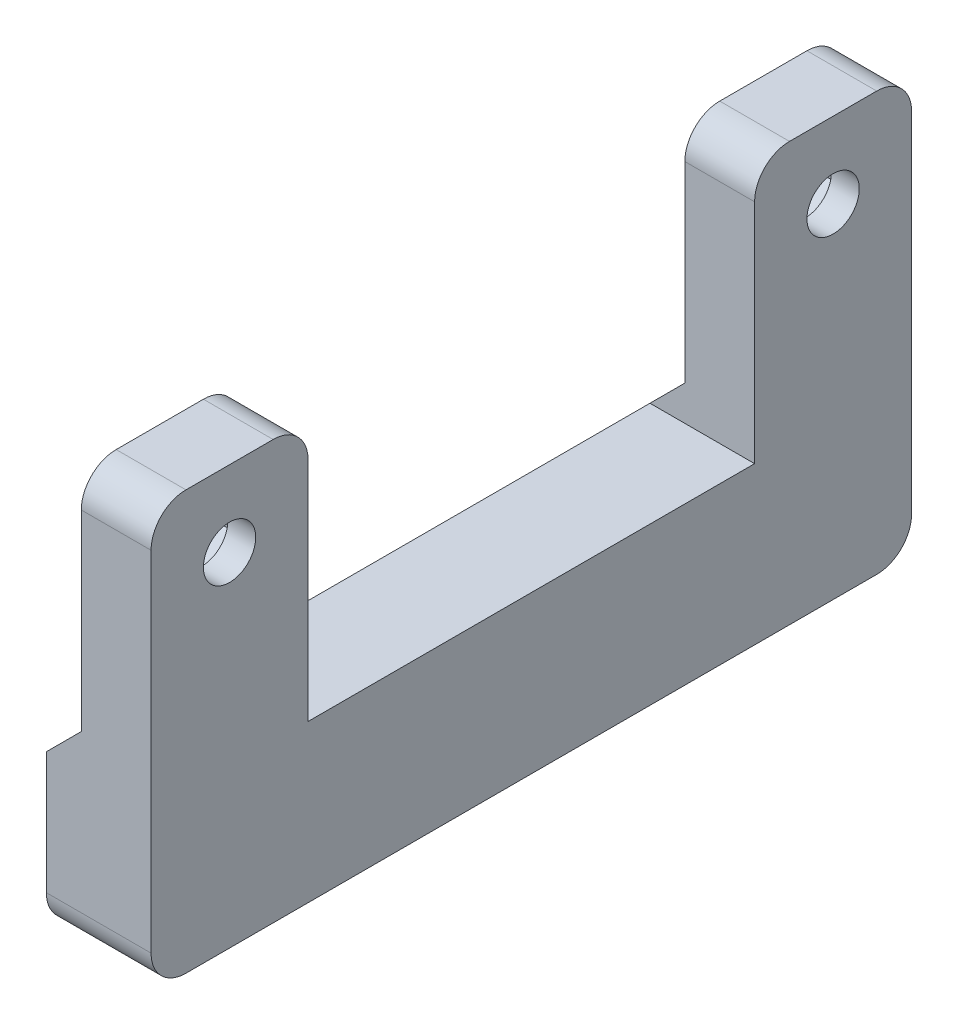
ISO-10303-21;
HEADER;
FILE_DESCRIPTION(('STEP AP214'),'2;1');
FILE_NAME('part.step','',(''),(''),'','','');
FILE_SCHEMA(('AUTOMOTIVE_DESIGN { 1 0 10303 214 1 1 1 1 }'));
ENDSEC;
DATA;
#1=APPLICATION_CONTEXT('core data for automotive mechanical design processes');
#2=APPLICATION_PROTOCOL_DEFINITION('international standard','automotive_design',2000,#1);
#3=PRODUCT_CONTEXT('',#1,'mechanical');
#4=PRODUCT('Part','Part','',(#3));
#5=PRODUCT_RELATED_PRODUCT_CATEGORY('part','',(#4));
#6=PRODUCT_DEFINITION_FORMATION('','',#4);
#7=PRODUCT_DEFINITION_CONTEXT('part definition',#1,'design');
#8=PRODUCT_DEFINITION('design','',#6,#7);
#9=PRODUCT_DEFINITION_SHAPE('','',#8);
#10=(LENGTH_UNIT() NAMED_UNIT(*) SI_UNIT(.MILLI.,.METRE.));
#11=(NAMED_UNIT(*) PLANE_ANGLE_UNIT() SI_UNIT($,.RADIAN.));
#12=(NAMED_UNIT(*) SI_UNIT($,.STERADIAN.) SOLID_ANGLE_UNIT());
#13=UNCERTAINTY_MEASURE_WITH_UNIT(LENGTH_MEASURE(1.E-05),#10,'distance_accuracy_value','');
#14=(GEOMETRIC_REPRESENTATION_CONTEXT(3) GLOBAL_UNCERTAINTY_ASSIGNED_CONTEXT((#13)) GLOBAL_UNIT_ASSIGNED_CONTEXT((#10,
#11,#12)) REPRESENTATION_CONTEXT('',''));
#15=CARTESIAN_POINT('',(0.,0.,0.));
#16=DIRECTION('',(0.,0.,1.));
#17=DIRECTION('',(1.,0.,0.));
#18=AXIS2_PLACEMENT_3D('',#15,#16,#17);
#19=CARTESIAN_POINT('',(0.,0.,0.));
#20=DIRECTION('',(1.,0.,0.));
#21=DIRECTION('',(0.,0.,-1.));
#22=AXIS2_PLACEMENT_3D('',#19,#20,#21);
#23=PLANE('',#22);
#24=DIRECTION('',(0.,-0.5,-0.866025403784439));
#25=VECTOR('',#24,1.);
#26=CARTESIAN_POINT('',(0.,5.33752026248425,10.4833333333333));
#27=LINE('',#26,#25);
#28=CARTESIAN_POINT('',(0.,5.33752026248425,10.4833333333333));
#29=VERTEX_POINT('',#28);
#30=CARTESIAN_POINT('',(0.,3.76424077894252,7.75833333333333));
#31=VERTEX_POINT('',#30);
#32=EDGE_CURVE('E294',#29,#31,#27,.T.);
#33=ORIENTED_EDGE('',*,*,#32,.F.);
#34=DIRECTION('',(0.,0.5,-0.866025403784439));
#35=VECTOR('',#34,1.);
#36=CARTESIAN_POINT('',(0.,3.76424077894252,13.2083333333333));
#37=LINE('',#36,#35);
#38=CARTESIAN_POINT('',(0.,3.76424077894252,13.2083333333333));
#39=VERTEX_POINT('',#38);
#40=EDGE_CURVE('E292',#39,#29,#37,.T.);
#41=ORIENTED_EDGE('',*,*,#40,.F.);
#42=DIRECTION('',(0.,1.,0.));
#43=VECTOR('',#42,1.);
#44=CARTESIAN_POINT('',(0.,0.617681811859059,13.2083333333333));
#45=LINE('',#44,#43);
#46=CARTESIAN_POINT('',(0.,0.617681811859059,13.2083333333333));
#47=VERTEX_POINT('',#46);
#48=EDGE_CURVE('E276',#47,#39,#45,.T.);
#49=ORIENTED_EDGE('',*,*,#48,.F.);
#50=DIRECTION('',(0.,0.5,0.866025403784439));
#51=VECTOR('',#50,1.);
#52=CARTESIAN_POINT('',(0.,-0.955597671682672,10.4833333333333));
#53=LINE('',#52,#51);
#54=CARTESIAN_POINT('',(0.,-0.955597671682672,10.4833333333333));
#55=VERTEX_POINT('',#54);
#56=EDGE_CURVE('E304',#55,#47,#53,.T.);
#57=ORIENTED_EDGE('',*,*,#56,.F.);
#58=DIRECTION('',(0.,-0.5,0.866025403784438));
#59=VECTOR('',#58,1.);
#60=CARTESIAN_POINT('',(0.,0.617681811859061,7.75833333333333));
#61=LINE('',#60,#59);
#62=CARTESIAN_POINT('',(0.,0.617681811859061,7.75833333333333));
#63=VERTEX_POINT('',#62);
#64=EDGE_CURVE('E301',#63,#55,#61,.T.);
#65=ORIENTED_EDGE('',*,*,#64,.F.);
#66=DIRECTION('',(0.,-1.,0.));
#67=VECTOR('',#66,1.);
#68=CARTESIAN_POINT('',(0.,3.76424077894252,7.75833333333333));
#69=LINE('',#68,#67);
#70=EDGE_CURVE('E298',#31,#63,#69,.T.);
#71=ORIENTED_EDGE('',*,*,#70,.F.);
#72=EDGE_LOOP('',(#33,#41,#49,#57,#65,#71));
#73=FACE_BOUND('',#72,.T.);
#74=DIRECTION('',(0.,-1.,0.));
#75=VECTOR('',#74,1.);
#76=CARTESIAN_POINT('',(0.,6.54166666666667,14.9833333333333));
#77=LINE('',#76,#75);
#78=CARTESIAN_POINT('',(0.,4.54166666666667,14.9833333333333));
#79=VERTEX_POINT('',#78);
#80=CARTESIAN_POINT('',(0.,-6.45833333333333,14.9833333333333));
#81=VERTEX_POINT('',#80);
#82=EDGE_CURVE('E405',#79,#81,#77,.T.);
#83=ORIENTED_EDGE('',*,*,#82,.F.);
#84=CARTESIAN_POINT('',(0.,4.54166666666667,12.9833333333333));
#85=DIRECTION('',(1.,0.,0.));
#86=DIRECTION('',(0.,0.,-1.));
#87=AXIS2_PLACEMENT_3D('',#84,#85,#86);
#88=CIRCLE('',#87,2.);
#89=CARTESIAN_POINT('',(0.,6.54166666666667,12.9833333333333));
#90=VERTEX_POINT('',#89);
#91=EDGE_CURVE('E455',#79,#90,#88,.F.);
#92=ORIENTED_EDGE('',*,*,#91,.T.);
#93=DIRECTION('',(0.,0.,1.));
#94=VECTOR('',#93,1.);
#95=CARTESIAN_POINT('',(0.,6.54166666666667,5.98333333333334));
#96=LINE('',#95,#94);
#97=CARTESIAN_POINT('',(0.,6.54166666666667,7.98333333333334));
#98=VERTEX_POINT('',#97);
#99=EDGE_CURVE('E402',#98,#90,#96,.T.);
#100=ORIENTED_EDGE('',*,*,#99,.F.);
#101=CARTESIAN_POINT('',(0.,4.54166666666667,7.98333333333334));
#102=DIRECTION('',(1.,0.,0.));
#103=DIRECTION('',(0.,0.,-1.));
#104=AXIS2_PLACEMENT_3D('',#101,#102,#103);
#105=CIRCLE('',#104,2.);
#106=CARTESIAN_POINT('',(0.,4.54166666666667,5.98333333333334));
#107=VERTEX_POINT('',#106);
#108=EDGE_CURVE('E453',#98,#107,#105,.F.);
#109=ORIENTED_EDGE('',*,*,#108,.T.);
#110=DIRECTION('',(0.,1.,0.));
#111=VECTOR('',#110,1.);
#112=CARTESIAN_POINT('',(0.,-17.4583333333333,5.98333333333334));
#113=LINE('',#112,#111);
#114=CARTESIAN_POINT('',(0.,-6.45833333333333,5.98333333333334));
#115=VERTEX_POINT('',#114);
#116=EDGE_CURVE('E399',#115,#107,#113,.T.);
#117=ORIENTED_EDGE('',*,*,#116,.F.);
#118=DIRECTION('',(0.,0.,-1.));
#119=VECTOR('',#118,1.);
#120=CARTESIAN_POINT('',(0.,-6.45833333333333,5.98333333333334));
#121=LINE('',#120,#119);
#122=EDGE_CURVE('E269',#81,#115,#121,.T.);
#123=ORIENTED_EDGE('',*,*,#122,.F.);
#124=EDGE_LOOP('',(#83,#92,#100,#109,#117,#123));
#125=FACE_BOUND('',#124,.T.);
#126=ADVANCED_FACE('F37',(#73,#125),#23,.F.);
#127=DIRECTION('',(0.,-0.5,-0.866025403784439));
#128=VECTOR('',#127,1.);
#129=CARTESIAN_POINT('',(0.,5.33752026248426,45.0833333333333));
#130=LINE('',#129,#128);
#131=CARTESIAN_POINT('',(0.,5.33752026248425,45.0833333333333));
#132=VERTEX_POINT('',#131);
#133=CARTESIAN_POINT('',(0.,3.76424077894252,42.3583333333333));
#134=VERTEX_POINT('',#133);
#135=EDGE_CURVE('E262',#132,#134,#130,.T.);
#136=ORIENTED_EDGE('',*,*,#135,.F.);
#137=DIRECTION('',(0.,0.5,-0.866025403784438));
#138=VECTOR('',#137,1.);
#139=CARTESIAN_POINT('',(0.,3.76424077894252,47.8083333333333));
#140=LINE('',#139,#138);
#141=CARTESIAN_POINT('',(0.,3.76424077894252,47.8083333333333));
#142=VERTEX_POINT('',#141);
#143=EDGE_CURVE('E260',#142,#132,#140,.T.);
#144=ORIENTED_EDGE('',*,*,#143,.F.);
#145=DIRECTION('',(0.,1.,0.));
#146=VECTOR('',#145,1.);
#147=CARTESIAN_POINT('',(0.,0.617681811859057,47.8083333333333));
#148=LINE('',#147,#146);
#149=CARTESIAN_POINT('',(0.,0.617681811859057,47.8083333333333));
#150=VERTEX_POINT('',#149);
#151=EDGE_CURVE('E326',#150,#142,#148,.T.);
#152=ORIENTED_EDGE('',*,*,#151,.F.);
#153=DIRECTION('',(0.,0.5,0.866025403784439));
#154=VECTOR('',#153,1.);
#155=CARTESIAN_POINT('',(0.,-0.955597671682677,45.0833333333333));
#156=LINE('',#155,#154);
#157=CARTESIAN_POINT('',(0.,-0.955597671682677,45.0833333333333));
#158=VERTEX_POINT('',#157);
#159=EDGE_CURVE('E350',#158,#150,#156,.T.);
#160=ORIENTED_EDGE('',*,*,#159,.F.);
#161=DIRECTION('',(0.,-0.5,0.866025403784438));
#162=VECTOR('',#161,1.);
#163=CARTESIAN_POINT('',(0.,0.617681811859057,42.3583333333333));
#164=LINE('',#163,#162);
#165=CARTESIAN_POINT('',(0.,0.617681811859057,42.3583333333333));
#166=VERTEX_POINT('',#165);
#167=EDGE_CURVE('E347',#166,#158,#164,.T.);
#168=ORIENTED_EDGE('',*,*,#167,.F.);
#169=DIRECTION('',(0.,-1.,0.));
#170=VECTOR('',#169,1.);
#171=CARTESIAN_POINT('',(0.,3.76424077894252,42.3583333333333));
#172=LINE('',#171,#170);
#173=EDGE_CURVE('E344',#134,#166,#172,.T.);
#174=ORIENTED_EDGE('',*,*,#173,.F.);
#175=EDGE_LOOP('',(#136,#144,#152,#160,#168,#174));
#176=FACE_BOUND('',#175,.T.);
#177=DIRECTION('',(0.,0.,1.));
#178=VECTOR('',#177,1.);
#179=CARTESIAN_POINT('',(0.,6.54166666666667,40.5833333333333));
#180=LINE('',#179,#178);
#181=CARTESIAN_POINT('',(0.,6.54166666666667,42.5833333333333));
#182=VERTEX_POINT('',#181);
#183=CARTESIAN_POINT('',(0.,6.54166666666667,47.5833333333333));
#184=VERTEX_POINT('',#183);
#185=EDGE_CURVE('E369',#182,#184,#180,.T.);
#186=ORIENTED_EDGE('',*,*,#185,.F.);
#187=CARTESIAN_POINT('',(0.,4.54166666666667,42.5833333333333));
#188=DIRECTION('',(1.,0.,0.));
#189=DIRECTION('',(0.,0.,-1.));
#190=AXIS2_PLACEMENT_3D('',#187,#188,#189);
#191=CIRCLE('',#190,2.);
#192=CARTESIAN_POINT('',(0.,4.54166666666667,40.5833333333333));
#193=VERTEX_POINT('',#192);
#194=EDGE_CURVE('E446',#182,#193,#191,.F.);
#195=ORIENTED_EDGE('',*,*,#194,.T.);
#196=DIRECTION('',(0.,1.,0.));
#197=VECTOR('',#196,1.);
#198=CARTESIAN_POINT('',(0.,-8.45833333333334,40.5833333333333));
#199=LINE('',#198,#197);
#200=CARTESIAN_POINT('',(0.,-6.45833333333333,40.5833333333333));
#201=VERTEX_POINT('',#200);
#202=EDGE_CURVE('E378',#201,#193,#199,.T.);
#203=ORIENTED_EDGE('',*,*,#202,.F.);
#204=DIRECTION('',(0.,0.,-1.));
#205=VECTOR('',#204,1.);
#206=CARTESIAN_POINT('',(0.,-6.45833333333333,40.5833333333333));
#207=LINE('',#206,#205);
#208=CARTESIAN_POINT('',(0.,-6.45833333333333,49.5833333333333));
#209=VERTEX_POINT('',#208);
#210=EDGE_CURVE('E232',#209,#201,#207,.T.);
#211=ORIENTED_EDGE('',*,*,#210,.F.);
#212=DIRECTION('',(0.,-1.,0.));
#213=VECTOR('',#212,1.);
#214=CARTESIAN_POINT('',(0.,6.54166666666667,49.5833333333333));
#215=LINE('',#214,#213);
#216=CARTESIAN_POINT('',(0.,4.54166666666667,49.5833333333333));
#217=VERTEX_POINT('',#216);
#218=EDGE_CURVE('E397',#217,#209,#215,.T.);
#219=ORIENTED_EDGE('',*,*,#218,.F.);
#220=CARTESIAN_POINT('',(0.,4.54166666666667,47.5833333333333));
#221=DIRECTION('',(1.,0.,0.));
#222=DIRECTION('',(0.,0.,-1.));
#223=AXIS2_PLACEMENT_3D('',#220,#221,#222);
#224=CIRCLE('',#223,2.);
#225=EDGE_CURVE('E444',#217,#184,#224,.F.);
#226=ORIENTED_EDGE('',*,*,#225,.T.);
#227=EDGE_LOOP('',(#186,#195,#203,#211,#219,#226));
#228=FACE_BOUND('',#227,.T.);
#229=ADVANCED_FACE('F511',(#176,#228),#23,.F.);
#230=CARTESIAN_POINT('',(4.,2.19096129540079,45.0833333333333));
#231=DIRECTION('',(-1.,0.,0.));
#232=DIRECTION('',(0.,0.,1.));
#233=AXIS2_PLACEMENT_3D('',#230,#231,#232);
#234=CYLINDRICAL_SURFACE('',#233,1.5);
#235=CARTESIAN_POINT('',(4.,2.19096129540079,45.0833333333333));
#236=DIRECTION('',(-1.,0.,0.));
#237=DIRECTION('',(0.,0.,1.));
#238=AXIS2_PLACEMENT_3D('',#235,#236,#237);
#239=CIRCLE('',#238,1.5);
#240=CARTESIAN_POINT('',(4.,2.19096129540079,46.5833333333333));
#241=VERTEX_POINT('',#240);
#242=EDGE_CURVE('E370',#241,#241,#239,.T.);
#243=ORIENTED_EDGE('',*,*,#242,.F.);
#244=EDGE_LOOP('',(#243));
#245=FACE_BOUND('',#244,.T.);
#246=CARTESIAN_POINT('',(2.4,2.19096129540079,45.0833333333333));
#247=DIRECTION('',(-1.,0.,0.));
#248=DIRECTION('',(0.,0.,1.));
#249=AXIS2_PLACEMENT_3D('',#246,#247,#248);
#250=CIRCLE('',#249,1.5);
#251=CARTESIAN_POINT('',(2.4,2.19096129540079,46.5833333333333));
#252=VERTEX_POINT('',#251);
#253=EDGE_CURVE('E373',#252,#252,#250,.F.);
#254=ORIENTED_EDGE('',*,*,#253,.F.);
#255=EDGE_LOOP('',(#254));
#256=FACE_BOUND('',#255,.T.);
#257=ADVANCED_FACE('F517',(#245,#256),#234,.F.);
#258=CARTESIAN_POINT('',(4.,2.19096129540079,10.4833333333333));
#259=DIRECTION('',(-1.,0.,0.));
#260=DIRECTION('',(0.,0.,1.));
#261=AXIS2_PLACEMENT_3D('',#258,#259,#260);
#262=CYLINDRICAL_SURFACE('',#261,1.5);
#263=CARTESIAN_POINT('',(4.,2.19096129540079,10.4833333333333));
#264=DIRECTION('',(-1.,0.,0.));
#265=DIRECTION('',(0.,0.,1.));
#266=AXIS2_PLACEMENT_3D('',#263,#264,#265);
#267=CIRCLE('',#266,1.5);
#268=CARTESIAN_POINT('',(4.,2.19096129540079,11.9833333333333));
#269=VERTEX_POINT('',#268);
#270=EDGE_CURVE('E366',#269,#269,#267,.T.);
#271=ORIENTED_EDGE('',*,*,#270,.F.);
#272=EDGE_LOOP('',(#271));
#273=FACE_BOUND('',#272,.T.);
#274=CARTESIAN_POINT('',(2.4,2.19096129540079,10.4833333333333));
#275=DIRECTION('',(-1.,0.,0.));
#276=DIRECTION('',(0.,0.,1.));
#277=AXIS2_PLACEMENT_3D('',#274,#275,#276);
#278=CIRCLE('',#277,1.5);
#279=CARTESIAN_POINT('',(2.4,2.19096129540079,11.9833333333333));
#280=VERTEX_POINT('',#279);
#281=EDGE_CURVE('E311',#280,#280,#278,.F.);
#282=ORIENTED_EDGE('',*,*,#281,.F.);
#283=EDGE_LOOP('',(#282));
#284=FACE_BOUND('',#283,.T.);
#285=ADVANCED_FACE('F541',(#273,#284),#262,.F.);
#286=CARTESIAN_POINT('',(4.,6.54166666666667,40.5833333333333));
#287=DIRECTION('',(0.,-1.,0.));
#288=DIRECTION('',(0.,0.,-1.));
#289=AXIS2_PLACEMENT_3D('',#286,#287,#288);
#290=PLANE('',#289);
#291=DIRECTION('',(0.,0.,1.));
#292=VECTOR('',#291,1.);
#293=CARTESIAN_POINT('',(4.,6.54166666666667,40.5833333333333));
#294=LINE('',#293,#292);
#295=CARTESIAN_POINT('',(4.,6.54166666666667,42.5833333333333));
#296=VERTEX_POINT('',#295);
#297=CARTESIAN_POINT('',(4.,6.54166666666667,47.5833333333333));
#298=VERTEX_POINT('',#297);
#299=EDGE_CURVE('E374',#296,#298,#294,.T.);
#300=ORIENTED_EDGE('',*,*,#299,.F.);
#301=DIRECTION('',(-1.,0.,0.));
#302=VECTOR('',#301,1.);
#303=CARTESIAN_POINT('',(4.,6.54166666666667,42.5833333333333));
#304=LINE('',#303,#302);
#305=EDGE_CURVE('E441',#296,#182,#304,.T.);
#306=ORIENTED_EDGE('',*,*,#305,.T.);
#307=ORIENTED_EDGE('',*,*,#185,.T.);
#308=DIRECTION('',(-1.,0.,0.));
#309=VECTOR('',#308,1.);
#310=CARTESIAN_POINT('',(4.,6.54166666666667,47.5833333333333));
#311=LINE('',#310,#309);
#312=EDGE_CURVE('E439',#184,#298,#311,.F.);
#313=ORIENTED_EDGE('',*,*,#312,.T.);
#314=EDGE_LOOP('',(#300,#306,#307,#313));
#315=FACE_BOUND('',#314,.T.);
#316=ADVANCED_FACE('F538',(#315),#290,.F.);
#317=CARTESIAN_POINT('',(4.,6.54166666666667,49.5833333333333));
#318=DIRECTION('',(0.,0.,-1.));
#319=DIRECTION('',(-1.,0.,0.));
#320=AXIS2_PLACEMENT_3D('',#317,#318,#319);
#321=PLANE('',#320);
#322=ORIENTED_EDGE('',*,*,#218,.T.);
#323=DIRECTION('',(0.707106781186549,0.707106781186546,0.));
#324=VECTOR('',#323,1.);
#325=CARTESIAN_POINT('',(-2.,-8.45833333333333,49.5833333333333));
#326=LINE('',#325,#324);
#327=CARTESIAN_POINT('',(-2.,-8.45833333333333,49.5833333333333));
#328=VERTEX_POINT('',#327);
#329=EDGE_CURVE('E11',#209,#328,#326,.F.);
#330=ORIENTED_EDGE('',*,*,#329,.T.);
#331=DIRECTION('',(0.,1.,0.));
#332=VECTOR('',#331,1.);
#333=CARTESIAN_POINT('',(-2.,-6.45833333333333,49.5833333333333));
#334=LINE('',#333,#332);
#335=CARTESIAN_POINT('',(-2.,-15.4583333333333,49.5833333333333));
#336=VERTEX_POINT('',#335);
#337=EDGE_CURVE('E243',#336,#328,#334,.T.);
#338=ORIENTED_EDGE('',*,*,#337,.F.);
#339=DIRECTION('',(-1.,0.,0.));
#340=VECTOR('',#339,1.);
#341=CARTESIAN_POINT('',(4.,-15.4583333333333,49.5833333333333));
#342=LINE('',#341,#340);
#343=CARTESIAN_POINT('',(4.,-15.4583333333333,49.5833333333333));
#344=VERTEX_POINT('',#343);
#345=EDGE_CURVE('E425',#336,#344,#342,.F.);
#346=ORIENTED_EDGE('',*,*,#345,.T.);
#347=DIRECTION('',(0.,-1.,0.));
#348=VECTOR('',#347,1.);
#349=CARTESIAN_POINT('',(4.,6.54166666666667,49.5833333333333));
#350=LINE('',#349,#348);
#351=CARTESIAN_POINT('',(4.,4.54166666666667,49.5833333333333));
#352=VERTEX_POINT('',#351);
#353=EDGE_CURVE('E377',#352,#344,#350,.T.);
#354=ORIENTED_EDGE('',*,*,#353,.F.);
#355=DIRECTION('',(-1.,0.,0.));
#356=VECTOR('',#355,1.);
#357=CARTESIAN_POINT('',(4.,4.54166666666667,49.5833333333333));
#358=LINE('',#357,#356);
#359=EDGE_CURVE('E422',#352,#217,#358,.T.);
#360=ORIENTED_EDGE('',*,*,#359,.T.);
#361=EDGE_LOOP('',(#322,#330,#338,#346,#354,#360));
#362=FACE_BOUND('',#361,.T.);
#363=ADVANCED_FACE('F535',(#362),#321,.F.);
#364=CARTESIAN_POINT('',(4.,-17.4583333333333,49.5833333333333));
#365=DIRECTION('',(0.,1.,0.));
#366=DIRECTION('',(0.,0.,1.));
#367=AXIS2_PLACEMENT_3D('',#364,#365,#366);
#368=PLANE('',#367);
#369=DIRECTION('',(0.,0.,-1.));
#370=VECTOR('',#369,1.);
#371=CARTESIAN_POINT('',(4.,-17.4583333333333,49.5833333333333));
#372=LINE('',#371,#370);
#373=CARTESIAN_POINT('',(4.,-17.4583333333333,47.5833333333333));
#374=VERTEX_POINT('',#373);
#375=CARTESIAN_POINT('',(4.,-17.4583333333333,7.98333333333334));
#376=VERTEX_POINT('',#375);
#377=EDGE_CURVE('E381',#374,#376,#372,.T.);
#378=ORIENTED_EDGE('',*,*,#377,.F.);
#379=DIRECTION('',(-1.,0.,0.));
#380=VECTOR('',#379,1.);
#381=CARTESIAN_POINT('',(4.,-17.4583333333333,47.5833333333333));
#382=LINE('',#381,#380);
#383=CARTESIAN_POINT('',(-2.,-17.4583333333333,47.5833333333333));
#384=VERTEX_POINT('',#383);
#385=EDGE_CURVE('E415',#374,#384,#382,.T.);
#386=ORIENTED_EDGE('',*,*,#385,.T.);
#387=DIRECTION('',(0.,0.,1.));
#388=VECTOR('',#387,1.);
#389=CARTESIAN_POINT('',(-2.,-17.4583333333333,49.5833333333333));
#390=LINE('',#389,#388);
#391=CARTESIAN_POINT('',(-2.,-17.4583333333333,7.98333333333334));
#392=VERTEX_POINT('',#391);
#393=EDGE_CURVE('E264',#392,#384,#390,.T.);
#394=ORIENTED_EDGE('',*,*,#393,.F.);
#395=DIRECTION('',(-1.,0.,0.));
#396=VECTOR('',#395,1.);
#397=CARTESIAN_POINT('',(4.,-17.4583333333333,7.98333333333334));
#398=LINE('',#397,#396);
#399=EDGE_CURVE('E409',#392,#376,#398,.F.);
#400=ORIENTED_EDGE('',*,*,#399,.T.);
#401=EDGE_LOOP('',(#378,#386,#394,#400));
#402=FACE_BOUND('',#401,.T.);
#403=ADVANCED_FACE('F488',(#402),#368,.F.);
#404=CARTESIAN_POINT('',(4.,-17.4583333333333,5.98333333333334));
#405=DIRECTION('',(0.,0.,1.));
#406=DIRECTION('',(0.,-1.,0.));
#407=AXIS2_PLACEMENT_3D('',#404,#405,#406);
#408=PLANE('',#407);
#409=DIRECTION('',(0.,-1.,0.));
#410=VECTOR('',#409,1.);
#411=CARTESIAN_POINT('',(-2.,-17.4583333333333,5.98333333333334));
#412=LINE('',#411,#410);
#413=CARTESIAN_POINT('',(-2.,-8.45833333333333,5.98333333333334));
#414=VERTEX_POINT('',#413);
#415=CARTESIAN_POINT('',(-2.,-15.4583333333333,5.98333333333334));
#416=VERTEX_POINT('',#415);
#417=EDGE_CURVE('E271',#414,#416,#412,.T.);
#418=ORIENTED_EDGE('',*,*,#417,.F.);
#419=DIRECTION('',(-0.707106781186549,-0.707106781186546,0.));
#420=VECTOR('',#419,1.);
#421=CARTESIAN_POINT('',(-2.,-8.45833333333333,5.98333333333334));
#422=LINE('',#421,#420);
#423=EDGE_CURVE('E53',#414,#115,#422,.F.);
#424=ORIENTED_EDGE('',*,*,#423,.T.);
#425=ORIENTED_EDGE('',*,*,#116,.T.);
#426=DIRECTION('',(-1.,0.,0.));
#427=VECTOR('',#426,1.);
#428=CARTESIAN_POINT('',(4.,4.54166666666667,5.98333333333334));
#429=LINE('',#428,#427);
#430=CARTESIAN_POINT('',(4.,4.54166666666667,5.98333333333334));
#431=VERTEX_POINT('',#430);
#432=EDGE_CURVE('E245',#107,#431,#429,.F.);
#433=ORIENTED_EDGE('',*,*,#432,.T.);
#434=DIRECTION('',(0.,1.,0.));
#435=VECTOR('',#434,1.);
#436=CARTESIAN_POINT('',(4.,-17.4583333333333,5.98333333333334));
#437=LINE('',#436,#435);
#438=CARTESIAN_POINT('',(4.,-15.4583333333333,5.98333333333334));
#439=VERTEX_POINT('',#438);
#440=EDGE_CURVE('E384',#439,#431,#437,.T.);
#441=ORIENTED_EDGE('',*,*,#440,.F.);
#442=DIRECTION('',(-1.,0.,0.));
#443=VECTOR('',#442,1.);
#444=CARTESIAN_POINT('',(4.,-15.4583333333333,5.98333333333334));
#445=LINE('',#444,#443);
#446=EDGE_CURVE('E462',#439,#416,#445,.T.);
#447=ORIENTED_EDGE('',*,*,#446,.T.);
#448=EDGE_LOOP('',(#418,#424,#425,#433,#441,#447));
#449=FACE_BOUND('',#448,.T.);
#450=ADVANCED_FACE('F478',(#449),#408,.F.);
#451=CARTESIAN_POINT('',(4.,6.54166666666667,5.98333333333334));
#452=DIRECTION('',(0.,-1.,0.));
#453=DIRECTION('',(0.,0.,-1.));
#454=AXIS2_PLACEMENT_3D('',#451,#452,#453);
#455=PLANE('',#454);
#456=ORIENTED_EDGE('',*,*,#99,.T.);
#457=DIRECTION('',(-1.,0.,0.));
#458=VECTOR('',#457,1.);
#459=CARTESIAN_POINT('',(4.,6.54166666666667,12.9833333333333));
#460=LINE('',#459,#458);
#461=CARTESIAN_POINT('',(4.,6.54166666666667,12.9833333333333));
#462=VERTEX_POINT('',#461);
#463=EDGE_CURVE('E460',#90,#462,#460,.F.);
#464=ORIENTED_EDGE('',*,*,#463,.T.);
#465=DIRECTION('',(0.,0.,1.));
#466=VECTOR('',#465,1.);
#467=CARTESIAN_POINT('',(4.,6.54166666666667,5.98333333333334));
#468=LINE('',#467,#466);
#469=CARTESIAN_POINT('',(4.,6.54166666666667,7.98333333333334));
#470=VERTEX_POINT('',#469);
#471=EDGE_CURVE('E387',#470,#462,#468,.T.);
#472=ORIENTED_EDGE('',*,*,#471,.F.);
#473=DIRECTION('',(-1.,0.,0.));
#474=VECTOR('',#473,1.);
#475=CARTESIAN_POINT('',(4.,6.54166666666667,7.98333333333334));
#476=LINE('',#475,#474);
#477=EDGE_CURVE('E457',#470,#98,#476,.T.);
#478=ORIENTED_EDGE('',*,*,#477,.T.);
#479=EDGE_LOOP('',(#456,#464,#472,#478));
#480=FACE_BOUND('',#479,.T.);
#481=ADVANCED_FACE('F503',(#480),#455,.F.);
#482=CARTESIAN_POINT('',(4.,6.54166666666667,14.9833333333333));
#483=DIRECTION('',(0.,0.,-1.));
#484=DIRECTION('',(0.,1.,0.));
#485=AXIS2_PLACEMENT_3D('',#482,#483,#484);
#486=PLANE('',#485);
#487=ORIENTED_EDGE('',*,*,#82,.T.);
#488=DIRECTION('',(0.707106781186549,0.707106781186546,0.));
#489=VECTOR('',#488,1.);
#490=CARTESIAN_POINT('',(-2.,-8.45833333333333,14.9833333333333));
#491=LINE('',#490,#489);
#492=CARTESIAN_POINT('',(-2.,-8.45833333333334,14.9833333333333));
#493=VERTEX_POINT('',#492);
#494=EDGE_CURVE('E237',#81,#493,#491,.F.);
#495=ORIENTED_EDGE('',*,*,#494,.T.);
#496=DIRECTION('',(-1.,0.,0.));
#497=VECTOR('',#496,1.);
#498=CARTESIAN_POINT('',(4.,-8.45833333333333,14.9833333333333));
#499=LINE('',#498,#497);
#500=CARTESIAN_POINT('',(4.,-8.45833333333333,14.9833333333333));
#501=VERTEX_POINT('',#500);
#502=EDGE_CURVE('E255',#501,#493,#499,.T.);
#503=ORIENTED_EDGE('',*,*,#502,.F.);
#504=DIRECTION('',(0.,-1.,0.));
#505=VECTOR('',#504,1.);
#506=CARTESIAN_POINT('',(4.,6.54166666666667,14.9833333333333));
#507=LINE('',#506,#505);
#508=CARTESIAN_POINT('',(4.,4.54166666666667,14.9833333333333));
#509=VERTEX_POINT('',#508);
#510=EDGE_CURVE('E390',#509,#501,#507,.T.);
#511=ORIENTED_EDGE('',*,*,#510,.F.);
#512=DIRECTION('',(-1.,0.,0.));
#513=VECTOR('',#512,1.);
#514=CARTESIAN_POINT('',(4.,4.54166666666667,14.9833333333333));
#515=LINE('',#514,#513);
#516=EDGE_CURVE('E450',#509,#79,#515,.T.);
#517=ORIENTED_EDGE('',*,*,#516,.T.);
#518=EDGE_LOOP('',(#487,#495,#503,#511,#517));
#519=FACE_BOUND('',#518,.T.);
#520=ADVANCED_FACE('F470',(#519),#486,.F.);
#521=CARTESIAN_POINT('',(4.,-8.45833333333333,14.9833333333333));
#522=DIRECTION('',(0.,-1.,0.));
#523=DIRECTION('',(0.,0.,-1.));
#524=AXIS2_PLACEMENT_3D('',#521,#522,#523);
#525=PLANE('',#524);
#526=ORIENTED_EDGE('',*,*,#502,.T.);
#527=DIRECTION('',(0.,0.,-1.));
#528=VECTOR('',#527,1.);
#529=CARTESIAN_POINT('',(-2.,-8.45833333333334,14.9833333333333));
#530=LINE('',#529,#528);
#531=CARTESIAN_POINT('',(-2.,-8.45833333333334,40.5833333333333));
#532=VERTEX_POINT('',#531);
#533=EDGE_CURVE('E242',#532,#493,#530,.T.);
#534=ORIENTED_EDGE('',*,*,#533,.F.);
#535=DIRECTION('',(-1.,0.,0.));
#536=VECTOR('',#535,1.);
#537=CARTESIAN_POINT('',(4.,-8.45833333333334,40.5833333333333));
#538=LINE('',#537,#536);
#539=CARTESIAN_POINT('',(4.,-8.45833333333334,40.5833333333333));
#540=VERTEX_POINT('',#539);
#541=EDGE_CURVE('E249',#540,#532,#538,.T.);
#542=ORIENTED_EDGE('',*,*,#541,.F.);
#543=DIRECTION('',(0.,0.,1.));
#544=VECTOR('',#543,1.);
#545=CARTESIAN_POINT('',(4.,-8.45833333333333,14.9833333333333));
#546=LINE('',#545,#544);
#547=EDGE_CURVE('E392',#501,#540,#546,.T.);
#548=ORIENTED_EDGE('',*,*,#547,.F.);
#549=EDGE_LOOP('',(#526,#534,#542,#548));
#550=FACE_BOUND('',#549,.T.);
#551=ADVANCED_FACE('F258',(#550),#525,.F.);
#552=CARTESIAN_POINT('',(4.,-8.45833333333334,40.5833333333333));
#553=DIRECTION('',(0.,0.,1.));
#554=DIRECTION('',(0.,-1.,0.));
#555=AXIS2_PLACEMENT_3D('',#552,#553,#554);
#556=PLANE('',#555);
#557=ORIENTED_EDGE('',*,*,#541,.T.);
#558=DIRECTION('',(-0.707106781186549,-0.707106781186546,0.));
#559=VECTOR('',#558,1.);
#560=CARTESIAN_POINT('',(-1.99999999999999,-8.45833333333332,40.5833333333333));
#561=LINE('',#560,#559);
#562=EDGE_CURVE('E46',#532,#201,#561,.F.);
#563=ORIENTED_EDGE('',*,*,#562,.T.);
#564=ORIENTED_EDGE('',*,*,#202,.T.);
#565=DIRECTION('',(-1.,0.,0.));
#566=VECTOR('',#565,1.);
#567=CARTESIAN_POINT('',(4.,4.54166666666667,40.5833333333333));
#568=LINE('',#567,#566);
#569=CARTESIAN_POINT('',(4.,4.54166666666667,40.5833333333333));
#570=VERTEX_POINT('',#569);
#571=EDGE_CURVE('E448',#193,#570,#568,.F.);
#572=ORIENTED_EDGE('',*,*,#571,.T.);
#573=DIRECTION('',(0.,1.,0.));
#574=VECTOR('',#573,1.);
#575=CARTESIAN_POINT('',(4.,-8.45833333333334,40.5833333333333));
#576=LINE('',#575,#574);
#577=EDGE_CURVE('E252',#540,#570,#576,.T.);
#578=ORIENTED_EDGE('',*,*,#577,.F.);
#579=EDGE_LOOP('',(#557,#563,#564,#572,#578));
#580=FACE_BOUND('',#579,.T.);
#581=ADVANCED_FACE('F250',(#580),#556,.F.);
#582=CARTESIAN_POINT('',(4.,0.,0.));
#583=DIRECTION('',(1.,0.,0.));
#584=DIRECTION('',(0.,0.,-1.));
#585=AXIS2_PLACEMENT_3D('',#582,#583,#584);
#586=PLANE('',#585);
#587=ORIENTED_EDGE('',*,*,#270,.T.);
#588=EDGE_LOOP('',(#587));
#589=FACE_BOUND('',#588,.T.);
#590=ORIENTED_EDGE('',*,*,#242,.T.);
#591=EDGE_LOOP('',(#590));
#592=FACE_BOUND('',#591,.T.);
#593=ORIENTED_EDGE('',*,*,#353,.T.);
#594=CARTESIAN_POINT('',(4.,-15.4583333333333,47.5833333333333));
#595=DIRECTION('',(1.,0.,0.));
#596=DIRECTION('',(0.,0.,-1.));
#597=AXIS2_PLACEMENT_3D('',#594,#595,#596);
#598=CIRCLE('',#597,2.);
#599=EDGE_CURVE('E437',#344,#374,#598,.T.);
#600=ORIENTED_EDGE('',*,*,#599,.T.);
#601=ORIENTED_EDGE('',*,*,#377,.T.);
#602=CARTESIAN_POINT('',(4.,-15.4583333333333,7.98333333333334));
#603=DIRECTION('',(1.,0.,0.));
#604=DIRECTION('',(0.,0.,-1.));
#605=AXIS2_PLACEMENT_3D('',#602,#603,#604);
#606=CIRCLE('',#605,2.);
#607=EDGE_CURVE('E427',#376,#439,#606,.T.);
#608=ORIENTED_EDGE('',*,*,#607,.T.);
#609=ORIENTED_EDGE('',*,*,#440,.T.);
#610=CARTESIAN_POINT('',(4.,4.54166666666667,7.98333333333334));
#611=DIRECTION('',(1.,0.,0.));
#612=DIRECTION('',(0.,0.,-1.));
#613=AXIS2_PLACEMENT_3D('',#610,#611,#612);
#614=CIRCLE('',#613,2.);
#615=EDGE_CURVE('E429',#431,#470,#614,.T.);
#616=ORIENTED_EDGE('',*,*,#615,.T.);
#617=ORIENTED_EDGE('',*,*,#471,.T.);
#618=CARTESIAN_POINT('',(4.,4.54166666666667,12.9833333333333));
#619=DIRECTION('',(1.,0.,0.));
#620=DIRECTION('',(0.,0.,-1.));
#621=AXIS2_PLACEMENT_3D('',#618,#619,#620);
#622=CIRCLE('',#621,2.);
#623=EDGE_CURVE('E431',#462,#509,#622,.T.);
#624=ORIENTED_EDGE('',*,*,#623,.T.);
#625=ORIENTED_EDGE('',*,*,#510,.T.);
#626=ORIENTED_EDGE('',*,*,#547,.T.);
#627=ORIENTED_EDGE('',*,*,#577,.T.);
#628=CARTESIAN_POINT('',(4.,4.54166666666667,42.5833333333333));
#629=DIRECTION('',(1.,0.,0.));
#630=DIRECTION('',(0.,0.,-1.));
#631=AXIS2_PLACEMENT_3D('',#628,#629,#630);
#632=CIRCLE('',#631,2.);
#633=EDGE_CURVE('E435',#570,#296,#632,.T.);
#634=ORIENTED_EDGE('',*,*,#633,.T.);
#635=ORIENTED_EDGE('',*,*,#299,.T.);
#636=CARTESIAN_POINT('',(4.,4.54166666666667,47.5833333333333));
#637=DIRECTION('',(1.,0.,0.));
#638=DIRECTION('',(0.,0.,-1.));
#639=AXIS2_PLACEMENT_3D('',#636,#637,#638);
#640=CIRCLE('',#639,2.);
#641=EDGE_CURVE('E433',#298,#352,#640,.T.);
#642=ORIENTED_EDGE('',*,*,#641,.T.);
#643=EDGE_LOOP('',(#593,#600,#601,#608,#609,#616,#617,#624,#625,#626,#627,#634,#635,#642));
#644=FACE_BOUND('',#643,.T.);
#645=ADVANCED_FACE('F494',(#589,#592,#644),#586,.T.);
#646=CARTESIAN_POINT('',(2.4,0.,0.));
#647=DIRECTION('',(-1.,0.,0.));
#648=DIRECTION('',(0.,0.,1.));
#649=AXIS2_PLACEMENT_3D('',#646,#647,#648);
#650=PLANE('',#649);
#651=DIRECTION('',(0.,0.5,-0.866025403784439));
#652=VECTOR('',#651,1.);
#653=CARTESIAN_POINT('',(2.4,3.76424077894252,13.2083333333333));
#654=LINE('',#653,#652);
#655=CARTESIAN_POINT('',(2.4,3.76424077894252,13.2083333333333));
#656=VERTEX_POINT('',#655);
#657=CARTESIAN_POINT('',(2.4,5.33752026248425,10.4833333333333));
#658=VERTEX_POINT('',#657);
#659=EDGE_CURVE('E272',#656,#658,#654,.T.);
#660=ORIENTED_EDGE('',*,*,#659,.T.);
#661=DIRECTION('',(0.,-0.5,-0.866025403784439));
#662=VECTOR('',#661,1.);
#663=CARTESIAN_POINT('',(2.4,5.33752026248425,10.4833333333333));
#664=LINE('',#663,#662);
#665=CARTESIAN_POINT('',(2.4,3.76424077894252,7.75833333333333));
#666=VERTEX_POINT('',#665);
#667=EDGE_CURVE('E275',#658,#666,#664,.T.);
#668=ORIENTED_EDGE('',*,*,#667,.T.);
#669=DIRECTION('',(0.,-1.,0.));
#670=VECTOR('',#669,1.);
#671=CARTESIAN_POINT('',(2.4,3.76424077894252,7.75833333333333));
#672=LINE('',#671,#670);
#673=CARTESIAN_POINT('',(2.4,0.617681811859061,7.75833333333333));
#674=VERTEX_POINT('',#673);
#675=EDGE_CURVE('E279',#666,#674,#672,.T.);
#676=ORIENTED_EDGE('',*,*,#675,.T.);
#677=DIRECTION('',(0.,-0.5,0.866025403784438));
#678=VECTOR('',#677,1.);
#679=CARTESIAN_POINT('',(2.4,0.617681811859061,7.75833333333333));
#680=LINE('',#679,#678);
#681=CARTESIAN_POINT('',(2.4,-0.955597671682672,10.4833333333333));
#682=VERTEX_POINT('',#681);
#683=EDGE_CURVE('E282',#674,#682,#680,.T.);
#684=ORIENTED_EDGE('',*,*,#683,.T.);
#685=DIRECTION('',(0.,0.5,0.866025403784439));
#686=VECTOR('',#685,1.);
#687=CARTESIAN_POINT('',(2.4,-0.955597671682672,10.4833333333333));
#688=LINE('',#687,#686);
#689=CARTESIAN_POINT('',(2.4,0.617681811859059,13.2083333333333));
#690=VERTEX_POINT('',#689);
#691=EDGE_CURVE('E285',#682,#690,#688,.T.);
#692=ORIENTED_EDGE('',*,*,#691,.T.);
#693=DIRECTION('',(0.,1.,0.));
#694=VECTOR('',#693,1.);
#695=CARTESIAN_POINT('',(2.4,0.617681811859059,13.2083333333333));
#696=LINE('',#695,#694);
#697=EDGE_CURVE('E288',#690,#656,#696,.T.);
#698=ORIENTED_EDGE('',*,*,#697,.T.);
#699=EDGE_LOOP('',(#660,#668,#676,#684,#692,#698));
#700=FACE_BOUND('',#699,.T.);
#701=ORIENTED_EDGE('',*,*,#281,.T.);
#702=EDGE_LOOP('',(#701));
#703=FACE_BOUND('',#702,.T.);
#704=ADVANCED_FACE('F676',(#700,#703),#650,.T.);
#705=CARTESIAN_POINT('',(2.4,3.76424077894252,13.2083333333333));
#706=DIRECTION('',(0.,0.866025403784439,0.5));
#707=DIRECTION('',(0.,-0.5,0.866025403784439));
#708=AXIS2_PLACEMENT_3D('',#705,#706,#707);
#709=PLANE('',#708);
#710=ORIENTED_EDGE('',*,*,#40,.T.);
#711=DIRECTION('',(-1.,0.,0.));
#712=VECTOR('',#711,1.);
#713=CARTESIAN_POINT('',(2.4,5.33752026248425,10.4833333333333));
#714=LINE('',#713,#712);
#715=EDGE_CURVE('E291',#658,#29,#714,.T.);
#716=ORIENTED_EDGE('',*,*,#715,.F.);
#717=ORIENTED_EDGE('',*,*,#659,.F.);
#718=DIRECTION('',(-1.,0.,0.));
#719=VECTOR('',#718,1.);
#720=CARTESIAN_POINT('',(2.4,3.76424077894252,13.2083333333333));
#721=LINE('',#720,#719);
#722=EDGE_CURVE('E309',#656,#39,#721,.T.);
#723=ORIENTED_EDGE('',*,*,#722,.T.);
#724=EDGE_LOOP('',(#710,#716,#717,#723));
#725=FACE_BOUND('',#724,.T.);
#726=ADVANCED_FACE('F814',(#725),#709,.F.);
#727=CARTESIAN_POINT('',(2.4,0.617681811859059,13.2083333333333));
#728=DIRECTION('',(0.,0.,1.));
#729=DIRECTION('',(1.,0.,0.));
#730=AXIS2_PLACEMENT_3D('',#727,#728,#729);
#731=PLANE('',#730);
#732=ORIENTED_EDGE('',*,*,#48,.T.);
#733=ORIENTED_EDGE('',*,*,#722,.F.);
#734=ORIENTED_EDGE('',*,*,#697,.F.);
#735=DIRECTION('',(-1.,0.,0.));
#736=VECTOR('',#735,1.);
#737=CARTESIAN_POINT('',(2.4,0.617681811859059,13.2083333333333));
#738=LINE('',#737,#736);
#739=EDGE_CURVE('E312',#690,#47,#738,.T.);
#740=ORIENTED_EDGE('',*,*,#739,.T.);
#741=EDGE_LOOP('',(#732,#733,#734,#740));
#742=FACE_BOUND('',#741,.T.);
#743=ADVANCED_FACE('F804',(#742),#731,.F.);
#744=CARTESIAN_POINT('',(2.4,-0.955597671682672,10.4833333333333));
#745=DIRECTION('',(0.,-0.866025403784438,0.5));
#746=DIRECTION('',(0.,-0.5,-0.866025403784439));
#747=AXIS2_PLACEMENT_3D('',#744,#745,#746);
#748=PLANE('',#747);
#749=ORIENTED_EDGE('',*,*,#56,.T.);
#750=ORIENTED_EDGE('',*,*,#739,.F.);
#751=ORIENTED_EDGE('',*,*,#691,.F.);
#752=DIRECTION('',(-1.,0.,0.));
#753=VECTOR('',#752,1.);
#754=CARTESIAN_POINT('',(2.4,-0.955597671682672,10.4833333333333));
#755=LINE('',#754,#753);
#756=EDGE_CURVE('E314',#682,#55,#755,.T.);
#757=ORIENTED_EDGE('',*,*,#756,.T.);
#758=EDGE_LOOP('',(#749,#750,#751,#757));
#759=FACE_BOUND('',#758,.T.);
#760=ADVANCED_FACE('F794',(#759),#748,.F.);
#761=CARTESIAN_POINT('',(2.4,0.617681811859061,7.75833333333333));
#762=DIRECTION('',(0.,-0.866025403784438,-0.5));
#763=DIRECTION('',(0.,0.5,-0.866025403784439));
#764=AXIS2_PLACEMENT_3D('',#761,#762,#763);
#765=PLANE('',#764);
#766=ORIENTED_EDGE('',*,*,#64,.T.);
#767=ORIENTED_EDGE('',*,*,#756,.F.);
#768=ORIENTED_EDGE('',*,*,#683,.F.);
#769=DIRECTION('',(-1.,0.,0.));
#770=VECTOR('',#769,1.);
#771=CARTESIAN_POINT('',(2.4,0.617681811859061,7.75833333333333));
#772=LINE('',#771,#770);
#773=EDGE_CURVE('E316',#674,#63,#772,.T.);
#774=ORIENTED_EDGE('',*,*,#773,.T.);
#775=EDGE_LOOP('',(#766,#767,#768,#774));
#776=FACE_BOUND('',#775,.T.);
#777=ADVANCED_FACE('F784',(#776),#765,.F.);
#778=CARTESIAN_POINT('',(2.4,3.76424077894252,7.75833333333333));
#779=DIRECTION('',(0.,0.,-1.));
#780=DIRECTION('',(-1.,0.,0.));
#781=AXIS2_PLACEMENT_3D('',#778,#779,#780);
#782=PLANE('',#781);
#783=ORIENTED_EDGE('',*,*,#70,.T.);
#784=ORIENTED_EDGE('',*,*,#773,.F.);
#785=ORIENTED_EDGE('',*,*,#675,.F.);
#786=DIRECTION('',(-1.,0.,0.));
#787=VECTOR('',#786,1.);
#788=CARTESIAN_POINT('',(2.4,3.76424077894252,7.75833333333333));
#789=LINE('',#788,#787);
#790=EDGE_CURVE('E318',#666,#31,#789,.T.);
#791=ORIENTED_EDGE('',*,*,#790,.T.);
#792=EDGE_LOOP('',(#783,#784,#785,#791));
#793=FACE_BOUND('',#792,.T.);
#794=ADVANCED_FACE('F774',(#793),#782,.F.);
#795=CARTESIAN_POINT('',(2.4,5.33752026248425,10.4833333333333));
#796=DIRECTION('',(0.,0.866025403784439,-0.5));
#797=DIRECTION('',(0.,0.5,0.866025403784439));
#798=AXIS2_PLACEMENT_3D('',#795,#796,#797);
#799=PLANE('',#798);
#800=ORIENTED_EDGE('',*,*,#32,.T.);
#801=ORIENTED_EDGE('',*,*,#790,.F.);
#802=ORIENTED_EDGE('',*,*,#667,.F.);
#803=ORIENTED_EDGE('',*,*,#715,.T.);
#804=EDGE_LOOP('',(#800,#801,#802,#803));
#805=FACE_BOUND('',#804,.T.);
#806=ADVANCED_FACE('F764',(#805),#799,.F.);
#807=CARTESIAN_POINT('',(2.4,0.,0.));
#808=DIRECTION('',(-1.,0.,0.));
#809=DIRECTION('',(0.,0.,1.));
#810=AXIS2_PLACEMENT_3D('',#807,#808,#809);
#811=PLANE('',#810);
#812=DIRECTION('',(0.,0.5,-0.866025403784438));
#813=VECTOR('',#812,1.);
#814=CARTESIAN_POINT('',(2.4,3.76424077894252,47.8083333333333));
#815=LINE('',#814,#813);
#816=CARTESIAN_POINT('',(2.4,3.76424077894252,47.8083333333333));
#817=VERTEX_POINT('',#816);
#818=CARTESIAN_POINT('',(2.4,5.33752026248426,45.0833333333333));
#819=VERTEX_POINT('',#818);
#820=EDGE_CURVE('E322',#817,#819,#815,.T.);
#821=ORIENTED_EDGE('',*,*,#820,.T.);
#822=DIRECTION('',(0.,-0.5,-0.866025403784439));
#823=VECTOR('',#822,1.);
#824=CARTESIAN_POINT('',(2.4,5.33752026248426,45.0833333333333));
#825=LINE('',#824,#823);
#826=CARTESIAN_POINT('',(2.4,3.76424077894252,42.3583333333333));
#827=VERTEX_POINT('',#826);
#828=EDGE_CURVE('E325',#819,#827,#825,.T.);
#829=ORIENTED_EDGE('',*,*,#828,.T.);
#830=DIRECTION('',(0.,-1.,0.));
#831=VECTOR('',#830,1.);
#832=CARTESIAN_POINT('',(2.4,3.76424077894252,42.3583333333333));
#833=LINE('',#832,#831);
#834=CARTESIAN_POINT('',(2.4,0.617681811859057,42.3583333333333));
#835=VERTEX_POINT('',#834);
#836=EDGE_CURVE('E329',#827,#835,#833,.T.);
#837=ORIENTED_EDGE('',*,*,#836,.T.);
#838=DIRECTION('',(0.,-0.5,0.866025403784438));
#839=VECTOR('',#838,1.);
#840=CARTESIAN_POINT('',(2.4,0.617681811859057,42.3583333333333));
#841=LINE('',#840,#839);
#842=CARTESIAN_POINT('',(2.4,-0.955597671682677,45.0833333333333));
#843=VERTEX_POINT('',#842);
#844=EDGE_CURVE('E332',#835,#843,#841,.T.);
#845=ORIENTED_EDGE('',*,*,#844,.T.);
#846=DIRECTION('',(0.,0.5,0.866025403784439));
#847=VECTOR('',#846,1.);
#848=CARTESIAN_POINT('',(2.4,-0.955597671682677,45.0833333333333));
#849=LINE('',#848,#847);
#850=CARTESIAN_POINT('',(2.4,0.617681811859057,47.8083333333333));
#851=VERTEX_POINT('',#850);
#852=EDGE_CURVE('E335',#843,#851,#849,.T.);
#853=ORIENTED_EDGE('',*,*,#852,.T.);
#854=DIRECTION('',(0.,1.,0.));
#855=VECTOR('',#854,1.);
#856=CARTESIAN_POINT('',(2.4,0.617681811859057,47.8083333333333));
#857=LINE('',#856,#855);
#858=EDGE_CURVE('E338',#851,#817,#857,.T.);
#859=ORIENTED_EDGE('',*,*,#858,.T.);
#860=EDGE_LOOP('',(#821,#829,#837,#845,#853,#859));
#861=FACE_BOUND('',#860,.T.);
#862=ORIENTED_EDGE('',*,*,#253,.T.);
#863=EDGE_LOOP('',(#862));
#864=FACE_BOUND('',#863,.T.);
#865=ADVANCED_FACE('F754',(#861,#864),#811,.T.);
#866=CARTESIAN_POINT('',(2.4,3.76424077894252,47.8083333333333));
#867=DIRECTION('',(0.,0.866025403784438,0.5));
#868=DIRECTION('',(0.,-0.5,0.866025403784438));
#869=AXIS2_PLACEMENT_3D('',#866,#867,#868);
#870=PLANE('',#869);
#871=ORIENTED_EDGE('',*,*,#143,.T.);
#872=DIRECTION('',(-1.,0.,0.));
#873=VECTOR('',#872,1.);
#874=CARTESIAN_POINT('',(2.4,5.33752026248426,45.0833333333333));
#875=LINE('',#874,#873);
#876=EDGE_CURVE('E340',#819,#132,#875,.T.);
#877=ORIENTED_EDGE('',*,*,#876,.F.);
#878=ORIENTED_EDGE('',*,*,#820,.F.);
#879=DIRECTION('',(-1.,0.,0.));
#880=VECTOR('',#879,1.);
#881=CARTESIAN_POINT('',(2.4,3.76424077894252,47.8083333333333));
#882=LINE('',#881,#880);
#883=EDGE_CURVE('E295',#817,#142,#882,.T.);
#884=ORIENTED_EDGE('',*,*,#883,.T.);
#885=EDGE_LOOP('',(#871,#877,#878,#884));
#886=FACE_BOUND('',#885,.T.);
#887=ADVANCED_FACE('F744',(#886),#870,.F.);
#888=CARTESIAN_POINT('',(2.4,0.617681811859057,47.8083333333333));
#889=DIRECTION('',(0.,0.,1.));
#890=DIRECTION('',(1.,0.,0.));
#891=AXIS2_PLACEMENT_3D('',#888,#889,#890);
#892=PLANE('',#891);
#893=ORIENTED_EDGE('',*,*,#151,.T.);
#894=ORIENTED_EDGE('',*,*,#883,.F.);
#895=ORIENTED_EDGE('',*,*,#858,.F.);
#896=DIRECTION('',(-1.,0.,0.));
#897=VECTOR('',#896,1.);
#898=CARTESIAN_POINT('',(2.4,0.617681811859057,47.8083333333333));
#899=LINE('',#898,#897);
#900=EDGE_CURVE('E356',#851,#150,#899,.T.);
#901=ORIENTED_EDGE('',*,*,#900,.T.);
#902=EDGE_LOOP('',(#893,#894,#895,#901));
#903=FACE_BOUND('',#902,.T.);
#904=ADVANCED_FACE('F734',(#903),#892,.F.);
#905=CARTESIAN_POINT('',(2.4,-0.955597671682677,45.0833333333333));
#906=DIRECTION('',(0.,-0.866025403784439,0.5));
#907=DIRECTION('',(0.,-0.5,-0.866025403784439));
#908=AXIS2_PLACEMENT_3D('',#905,#906,#907);
#909=PLANE('',#908);
#910=ORIENTED_EDGE('',*,*,#159,.T.);
#911=ORIENTED_EDGE('',*,*,#900,.F.);
#912=ORIENTED_EDGE('',*,*,#852,.F.);
#913=DIRECTION('',(-1.,0.,0.));
#914=VECTOR('',#913,1.);
#915=CARTESIAN_POINT('',(2.4,-0.955597671682677,45.0833333333333));
#916=LINE('',#915,#914);
#917=EDGE_CURVE('E358',#843,#158,#916,.T.);
#918=ORIENTED_EDGE('',*,*,#917,.T.);
#919=EDGE_LOOP('',(#910,#911,#912,#918));
#920=FACE_BOUND('',#919,.T.);
#921=ADVANCED_FACE('F724',(#920),#909,.F.);
#922=CARTESIAN_POINT('',(2.4,0.617681811859057,42.3583333333333));
#923=DIRECTION('',(0.,-0.866025403784438,-0.5));
#924=DIRECTION('',(0.,0.5,-0.866025403784439));
#925=AXIS2_PLACEMENT_3D('',#922,#923,#924);
#926=PLANE('',#925);
#927=ORIENTED_EDGE('',*,*,#167,.T.);
#928=ORIENTED_EDGE('',*,*,#917,.F.);
#929=ORIENTED_EDGE('',*,*,#844,.F.);
#930=DIRECTION('',(-1.,0.,0.));
#931=VECTOR('',#930,1.);
#932=CARTESIAN_POINT('',(2.4,0.617681811859057,42.3583333333333));
#933=LINE('',#932,#931);
#934=EDGE_CURVE('E360',#835,#166,#933,.T.);
#935=ORIENTED_EDGE('',*,*,#934,.T.);
#936=EDGE_LOOP('',(#927,#928,#929,#935));
#937=FACE_BOUND('',#936,.T.);
#938=ADVANCED_FACE('F714',(#937),#926,.F.);
#939=CARTESIAN_POINT('',(2.4,3.76424077894252,42.3583333333333));
#940=DIRECTION('',(0.,0.,-1.));
#941=DIRECTION('',(-1.,0.,0.));
#942=AXIS2_PLACEMENT_3D('',#939,#940,#941);
#943=PLANE('',#942);
#944=ORIENTED_EDGE('',*,*,#173,.T.);
#945=ORIENTED_EDGE('',*,*,#934,.F.);
#946=ORIENTED_EDGE('',*,*,#836,.F.);
#947=DIRECTION('',(-1.,0.,0.));
#948=VECTOR('',#947,1.);
#949=CARTESIAN_POINT('',(2.4,3.76424077894252,42.3583333333333));
#950=LINE('',#949,#948);
#951=EDGE_CURVE('E362',#827,#134,#950,.T.);
#952=ORIENTED_EDGE('',*,*,#951,.T.);
#953=EDGE_LOOP('',(#944,#945,#946,#952));
#954=FACE_BOUND('',#953,.T.);
#955=ADVANCED_FACE('F704',(#954),#943,.F.);
#956=CARTESIAN_POINT('',(2.4,5.33752026248426,45.0833333333333));
#957=DIRECTION('',(0.,0.866025403784439,-0.5));
#958=DIRECTION('',(0.,0.5,0.866025403784439));
#959=AXIS2_PLACEMENT_3D('',#956,#957,#958);
#960=PLANE('',#959);
#961=ORIENTED_EDGE('',*,*,#135,.T.);
#962=ORIENTED_EDGE('',*,*,#951,.F.);
#963=ORIENTED_EDGE('',*,*,#828,.F.);
#964=ORIENTED_EDGE('',*,*,#876,.T.);
#965=EDGE_LOOP('',(#961,#962,#963,#964));
#966=FACE_BOUND('',#965,.T.);
#967=ADVANCED_FACE('F583',(#966),#960,.F.);
#968=CARTESIAN_POINT('',(-2.,0.,0.));
#969=DIRECTION('',(1.,0.,0.));
#970=DIRECTION('',(0.,0.,-1.));
#971=AXIS2_PLACEMENT_3D('',#968,#969,#970);
#972=PLANE('',#971);
#973=ORIENTED_EDGE('',*,*,#533,.T.);
#974=DIRECTION('',(0.,0.,-1.));
#975=VECTOR('',#974,1.);
#976=CARTESIAN_POINT('',(-2.,-8.45833333333333,0.));
#977=LINE('',#976,#975);
#978=EDGE_CURVE('E244',#493,#414,#977,.T.);
#979=ORIENTED_EDGE('',*,*,#978,.T.);
#980=ORIENTED_EDGE('',*,*,#417,.T.);
#981=CARTESIAN_POINT('',(-2.,-15.4583333333333,7.98333333333334));
#982=DIRECTION('',(1.,0.,0.));
#983=DIRECTION('',(0.,0.,-1.));
#984=AXIS2_PLACEMENT_3D('',#981,#982,#983);
#985=CIRCLE('',#984,2.);
#986=EDGE_CURVE('E418',#416,#392,#985,.F.);
#987=ORIENTED_EDGE('',*,*,#986,.T.);
#988=ORIENTED_EDGE('',*,*,#393,.T.);
#989=CARTESIAN_POINT('',(-2.,-15.4583333333333,47.5833333333333));
#990=DIRECTION('',(1.,0.,0.));
#991=DIRECTION('',(0.,0.,-1.));
#992=AXIS2_PLACEMENT_3D('',#989,#990,#991);
#993=CIRCLE('',#992,2.);
#994=EDGE_CURVE('E420',#384,#336,#993,.F.);
#995=ORIENTED_EDGE('',*,*,#994,.T.);
#996=ORIENTED_EDGE('',*,*,#337,.T.);
#997=DIRECTION('',(0.,0.,-1.));
#998=VECTOR('',#997,1.);
#999=CARTESIAN_POINT('',(-2.,-8.45833333333333,0.));
#1000=LINE('',#999,#998);
#1001=EDGE_CURVE('E230',#328,#532,#1000,.T.);
#1002=ORIENTED_EDGE('',*,*,#1001,.T.);
#1003=EDGE_LOOP('',(#973,#979,#980,#987,#988,#995,#996,#1002));
#1004=FACE_BOUND('',#1003,.T.);
#1005=ADVANCED_FACE('F240',(#1004),#972,.F.);
#1006=CARTESIAN_POINT('',(4.,-15.4583333333333,47.5833333333333));
#1007=DIRECTION('',(-1.,0.,0.));
#1008=DIRECTION('',(0.,0.,1.));
#1009=AXIS2_PLACEMENT_3D('',#1006,#1007,#1008);
#1010=CYLINDRICAL_SURFACE('',#1009,2.);
#1011=ORIENTED_EDGE('',*,*,#599,.F.);
#1012=ORIENTED_EDGE('',*,*,#345,.F.);
#1013=ORIENTED_EDGE('',*,*,#994,.F.);
#1014=ORIENTED_EDGE('',*,*,#385,.F.);
#1015=EDGE_LOOP('',(#1011,#1012,#1013,#1014));
#1016=FACE_BOUND('',#1015,.T.);
#1017=ADVANCED_FACE('F543',(#1016),#1010,.T.);
#1018=CARTESIAN_POINT('',(4.,4.54166666666667,42.5833333333333));
#1019=DIRECTION('',(-1.,0.,0.));
#1020=DIRECTION('',(0.,0.,1.));
#1021=AXIS2_PLACEMENT_3D('',#1018,#1019,#1020);
#1022=CYLINDRICAL_SURFACE('',#1021,2.);
#1023=ORIENTED_EDGE('',*,*,#633,.F.);
#1024=ORIENTED_EDGE('',*,*,#571,.F.);
#1025=ORIENTED_EDGE('',*,*,#194,.F.);
#1026=ORIENTED_EDGE('',*,*,#305,.F.);
#1027=EDGE_LOOP('',(#1023,#1024,#1025,#1026));
#1028=FACE_BOUND('',#1027,.T.);
#1029=ADVANCED_FACE('F546',(#1028),#1022,.T.);
#1030=CARTESIAN_POINT('',(4.,4.54166666666667,47.5833333333333));
#1031=DIRECTION('',(-1.,0.,0.));
#1032=DIRECTION('',(0.,0.,1.));
#1033=AXIS2_PLACEMENT_3D('',#1030,#1031,#1032);
#1034=CYLINDRICAL_SURFACE('',#1033,2.);
#1035=ORIENTED_EDGE('',*,*,#641,.F.);
#1036=ORIENTED_EDGE('',*,*,#312,.F.);
#1037=ORIENTED_EDGE('',*,*,#225,.F.);
#1038=ORIENTED_EDGE('',*,*,#359,.F.);
#1039=EDGE_LOOP('',(#1035,#1036,#1037,#1038));
#1040=FACE_BOUND('',#1039,.T.);
#1041=ADVANCED_FACE('F550',(#1040),#1034,.T.);
#1042=CARTESIAN_POINT('',(4.,4.54166666666667,12.9833333333333));
#1043=DIRECTION('',(-1.,0.,0.));
#1044=DIRECTION('',(0.,0.,1.));
#1045=AXIS2_PLACEMENT_3D('',#1042,#1043,#1044);
#1046=CYLINDRICAL_SURFACE('',#1045,2.);
#1047=ORIENTED_EDGE('',*,*,#623,.F.);
#1048=ORIENTED_EDGE('',*,*,#463,.F.);
#1049=ORIENTED_EDGE('',*,*,#91,.F.);
#1050=ORIENTED_EDGE('',*,*,#516,.F.);
#1051=EDGE_LOOP('',(#1047,#1048,#1049,#1050));
#1052=FACE_BOUND('',#1051,.T.);
#1053=ADVANCED_FACE('F507',(#1052),#1046,.T.);
#1054=CARTESIAN_POINT('',(4.,4.54166666666667,7.98333333333334));
#1055=DIRECTION('',(-1.,0.,0.));
#1056=DIRECTION('',(0.,0.,1.));
#1057=AXIS2_PLACEMENT_3D('',#1054,#1055,#1056);
#1058=CYLINDRICAL_SURFACE('',#1057,2.);
#1059=ORIENTED_EDGE('',*,*,#615,.F.);
#1060=ORIENTED_EDGE('',*,*,#432,.F.);
#1061=ORIENTED_EDGE('',*,*,#108,.F.);
#1062=ORIENTED_EDGE('',*,*,#477,.F.);
#1063=EDGE_LOOP('',(#1059,#1060,#1061,#1062));
#1064=FACE_BOUND('',#1063,.T.);
#1065=ADVANCED_FACE('F498',(#1064),#1058,.T.);
#1066=CARTESIAN_POINT('',(4.,-15.4583333333333,7.98333333333334));
#1067=DIRECTION('',(-1.,0.,0.));
#1068=DIRECTION('',(0.,0.,1.));
#1069=AXIS2_PLACEMENT_3D('',#1066,#1067,#1068);
#1070=CYLINDRICAL_SURFACE('',#1069,2.);
#1071=ORIENTED_EDGE('',*,*,#607,.F.);
#1072=ORIENTED_EDGE('',*,*,#399,.F.);
#1073=ORIENTED_EDGE('',*,*,#986,.F.);
#1074=ORIENTED_EDGE('',*,*,#446,.F.);
#1075=EDGE_LOOP('',(#1071,#1072,#1073,#1074));
#1076=FACE_BOUND('',#1075,.T.);
#1077=ADVANCED_FACE('F492',(#1076),#1070,.T.);
#1078=CARTESIAN_POINT('',(-2.,-8.45833333333333,0.));
#1079=DIRECTION('',(0.707106781186546,-0.707106781186549,0.));
#1080=DIRECTION('',(0.,0.,-1.));
#1081=AXIS2_PLACEMENT_3D('',#1078,#1079,#1080);
#1082=PLANE('',#1081);
#1083=ORIENTED_EDGE('',*,*,#494,.F.);
#1084=ORIENTED_EDGE('',*,*,#122,.T.);
#1085=ORIENTED_EDGE('',*,*,#423,.F.);
#1086=ORIENTED_EDGE('',*,*,#978,.F.);
#1087=EDGE_LOOP('',(#1083,#1084,#1085,#1086));
#1088=FACE_BOUND('',#1087,.T.);
#1089=ADVANCED_FACE('F474',(#1088),#1082,.F.);
#1090=CARTESIAN_POINT('',(-2.,-8.45833333333333,0.));
#1091=DIRECTION('',(0.707106781186546,-0.707106781186549,0.));
#1092=DIRECTION('',(0.,0.,-1.));
#1093=AXIS2_PLACEMENT_3D('',#1090,#1091,#1092);
#1094=PLANE('',#1093);
#1095=ORIENTED_EDGE('',*,*,#329,.F.);
#1096=ORIENTED_EDGE('',*,*,#210,.T.);
#1097=ORIENTED_EDGE('',*,*,#562,.F.);
#1098=ORIENTED_EDGE('',*,*,#1001,.F.);
#1099=EDGE_LOOP('',(#1095,#1096,#1097,#1098));
#1100=FACE_BOUND('',#1099,.T.);
#1101=ADVANCED_FACE('F40',(#1100),#1094,.F.);
#1102=CLOSED_SHELL('',(#126,#229,#257,#285,#316,#363,#403,#450,#481,#520,#551,#581,#645,#704,
#726,#743,#760,#777,#794,#806,#865,#887,#904,#921,#938,#955,#967,#1005,#1017,#1029,#1041,#1053,
#1065,#1077,#1089,#1101));
#1103=MANIFOLD_SOLID_BREP('B2',#1102);
#1104=ADVANCED_BREP_SHAPE_REPRESENTATION('',(#18,#1103),#14);
#1105=SHAPE_DEFINITION_REPRESENTATION(#9,#1104);
ENDSEC;
END-ISO-10303-21;
